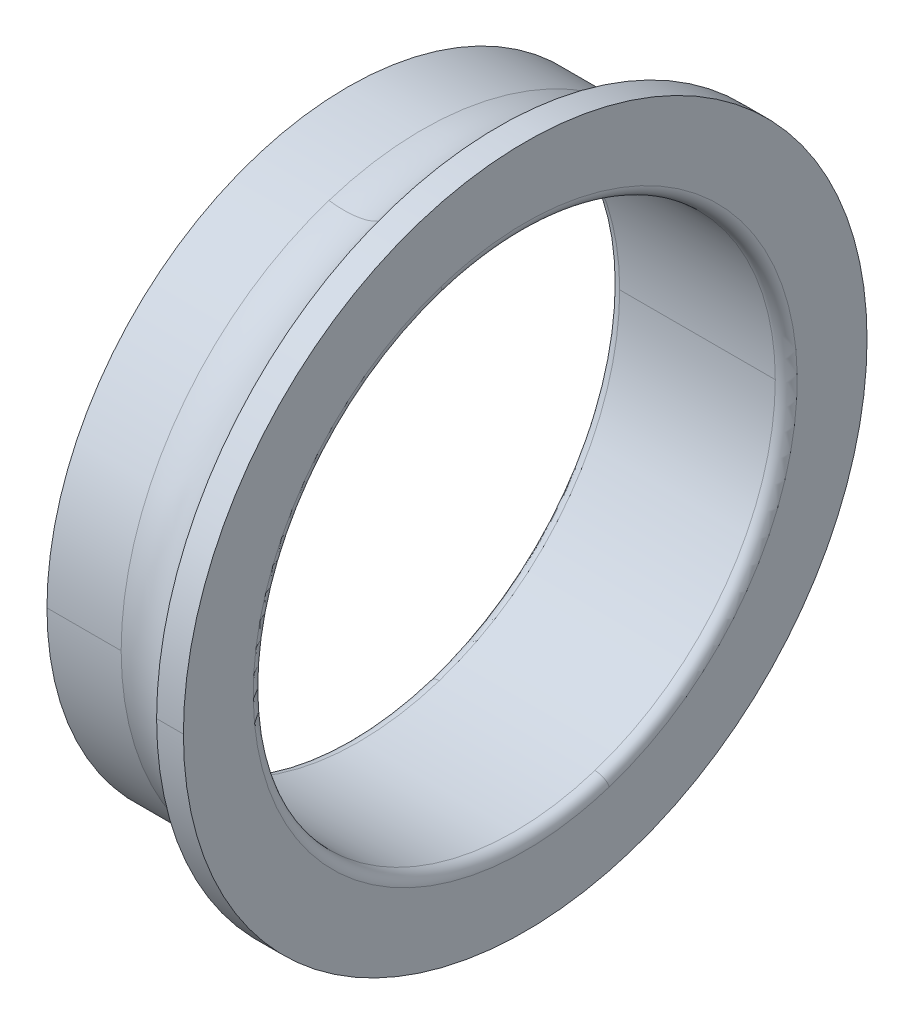
ISO-10303-21;
HEADER;
FILE_DESCRIPTION(('STEP AP214'),'2;1');
FILE_NAME('part.step','',(''),(''),'','','');
FILE_SCHEMA(('AUTOMOTIVE_DESIGN { 1 0 10303 214 1 1 1 1 }'));
ENDSEC;
DATA;
#1=APPLICATION_CONTEXT('core data for automotive mechanical design processes');
#2=APPLICATION_PROTOCOL_DEFINITION('international standard','automotive_design',2000,#1);
#3=PRODUCT_CONTEXT('',#1,'mechanical');
#4=PRODUCT('Part','Part','',(#3));
#5=PRODUCT_RELATED_PRODUCT_CATEGORY('part','',(#4));
#6=PRODUCT_DEFINITION_FORMATION('','',#4);
#7=PRODUCT_DEFINITION_CONTEXT('part definition',#1,'design');
#8=PRODUCT_DEFINITION('design','',#6,#7);
#9=PRODUCT_DEFINITION_SHAPE('','',#8);
#10=(LENGTH_UNIT() NAMED_UNIT(*) SI_UNIT(.MILLI.,.METRE.));
#11=(NAMED_UNIT(*) PLANE_ANGLE_UNIT() SI_UNIT($,.RADIAN.));
#12=(NAMED_UNIT(*) SI_UNIT($,.STERADIAN.) SOLID_ANGLE_UNIT());
#13=UNCERTAINTY_MEASURE_WITH_UNIT(LENGTH_MEASURE(1.E-05),#10,'distance_accuracy_value','');
#14=(GEOMETRIC_REPRESENTATION_CONTEXT(3) GLOBAL_UNCERTAINTY_ASSIGNED_CONTEXT((#13)) GLOBAL_UNIT_ASSIGNED_CONTEXT((#10,
#11,#12)) REPRESENTATION_CONTEXT('',''));
#15=CARTESIAN_POINT('',(0.,0.,0.));
#16=DIRECTION('',(0.,0.,1.));
#17=DIRECTION('',(1.,0.,0.));
#18=AXIS2_PLACEMENT_3D('',#15,#16,#17);
#19=CARTESIAN_POINT('',(34.,0.,0.));
#20=DIRECTION('',(1.,0.,0.));
#21=DIRECTION('',(0.,1.,0.));
#22=AXIS2_PLACEMENT_3D('',#19,#20,#21);
#23=CYLINDRICAL_SURFACE('',#22,57.61);
#24=DIRECTION('',(1.,0.,0.));
#25=VECTOR('',#24,1.);
#26=CARTESIAN_POINT('',(0.,0.,57.61));
#27=LINE('',#26,#25);
#28=CARTESIAN_POINT('',(0.,0.,57.61));
#29=VERTEX_POINT('',#28);
#30=CARTESIAN_POINT('',(14.211111332448,0.,57.61));
#31=VERTEX_POINT('',#30);
#32=EDGE_CURVE('E10',#29,#31,#27,.T.);
#33=ORIENTED_EDGE('',*,*,#32,.F.);
#34=CARTESIAN_POINT('',(0.,0.,0.));
#35=DIRECTION('',(1.,0.,0.));
#36=DIRECTION('',(0.,0.,-1.));
#37=AXIS2_PLACEMENT_3D('',#34,#35,#36);
#38=CIRCLE('',#37,57.61);
#39=CARTESIAN_POINT('',(0.,0.,-57.61));
#40=VERTEX_POINT('',#39);
#41=EDGE_CURVE('E24',#29,#40,#38,.T.);
#42=ORIENTED_EDGE('',*,*,#41,.T.);
#43=DIRECTION('',(1.,0.,0.));
#44=VECTOR('',#43,1.);
#45=CARTESIAN_POINT('',(0.,0.,-57.61));
#46=LINE('',#45,#44);
#47=CARTESIAN_POINT('',(14.211111332448,0.,-57.61));
#48=VERTEX_POINT('',#47);
#49=EDGE_CURVE('E325',#40,#48,#46,.T.);
#50=ORIENTED_EDGE('',*,*,#49,.T.);
#51=CARTESIAN_POINT('',(14.211111332448,0.,0.));
#52=DIRECTION('',(1.,0.,0.));
#53=DIRECTION('',(0.,0.,-1.));
#54=AXIS2_PLACEMENT_3D('',#51,#52,#53);
#55=CIRCLE('',#54,57.61);
#56=CARTESIAN_POINT('',(14.211111332448,-54.7903659037638,-17.8024690459407));
#57=VERTEX_POINT('',#56);
#58=EDGE_CURVE('E320',#57,#48,#55,.T.);
#59=ORIENTED_EDGE('',*,*,#58,.F.);
#60=CARTESIAN_POINT('',(14.211111332448,0.,0.));
#61=DIRECTION('',(1.,0.,0.));
#62=DIRECTION('',(0.,0.,-1.));
#63=AXIS2_PLACEMENT_3D('',#60,#61,#62);
#64=CIRCLE('',#63,57.61);
#65=EDGE_CURVE('E315',#31,#57,#64,.T.);
#66=ORIENTED_EDGE('',*,*,#65,.F.);
#67=EDGE_LOOP('',(#33,#42,#50,#59,#66));
#68=FACE_BOUND('',#67,.T.);
#69=ADVANCED_FACE('F16',(#68),#23,.T.);
#70=CARTESIAN_POINT('',(17.0000000000004,0.,0.));
#71=DIRECTION('',(1.,0.,0.));
#72=DIRECTION('',(0.,0.309016994374947,-0.951056516295154));
#73=AXIS2_PLACEMENT_3D('',#70,#71,#72);
#74=TOROIDAL_SURFACE('',#73,69.9999999999986,12.6999999999987);
#75=CARTESIAN_POINT('',(17.0000000000004,-66.5739561406594,-21.6311896062459));
#76=DIRECTION('',(0.,0.309016994374947,-0.951056516295154));
#77=DIRECTION('',(-0.219597532878165,0.927841750936756,0.301474059866578));
#78=AXIS2_PLACEMENT_3D('',#75,#76,#77);
#79=CIRCLE('',#78,12.6999999999987);
#80=CARTESIAN_POINT('',(28.866523290332,-62.2704254044252,-20.2328877066997));
#81=VERTEX_POINT('',#80);
#82=EDGE_CURVE('E311',#57,#81,#79,.T.);
#83=ORIENTED_EDGE('',*,*,#82,.T.);
#84=CARTESIAN_POINT('',(28.866523290332,0.,0.));
#85=DIRECTION('',(1.,0.,0.));
#86=DIRECTION('',(0.,0.,-1.));
#87=AXIS2_PLACEMENT_3D('',#84,#85,#86);
#88=CIRCLE('',#87,65.475);
#89=CARTESIAN_POINT('',(28.866523290332,0.,65.475));
#90=VERTEX_POINT('',#89);
#91=EDGE_CURVE('E109',#90,#81,#88,.T.);
#92=ORIENTED_EDGE('',*,*,#91,.F.);
#93=CARTESIAN_POINT('',(28.866523290332,0.,0.));
#94=DIRECTION('',(1.,0.,0.));
#95=DIRECTION('',(0.,0.,-1.));
#96=AXIS2_PLACEMENT_3D('',#93,#94,#95);
#97=CIRCLE('',#96,65.475);
#98=CARTESIAN_POINT('',(28.866523290332,62.2704254044252,20.2328877066997));
#99=VERTEX_POINT('',#98);
#100=EDGE_CURVE('E304',#99,#90,#97,.T.);
#101=ORIENTED_EDGE('',*,*,#100,.F.);
#102=CARTESIAN_POINT('',(17.0000000000004,66.5739561406594,21.6311896062459));
#103=DIRECTION('',(0.,-0.309016994374947,0.951056516295154));
#104=DIRECTION('',(-0.219597532878166,-0.927841750936756,-0.301474059866579));
#105=AXIS2_PLACEMENT_3D('',#102,#103,#104);
#106=CIRCLE('',#105,12.6999999999987);
#107=CARTESIAN_POINT('',(14.211111332448,54.7903659037638,17.8024690459407));
#108=VERTEX_POINT('',#107);
#109=EDGE_CURVE('E119',#108,#99,#106,.T.);
#110=ORIENTED_EDGE('',*,*,#109,.F.);
#111=CARTESIAN_POINT('',(14.211111332448,0.,0.));
#112=DIRECTION('',(1.,0.,0.));
#113=DIRECTION('',(0.,0.,-1.));
#114=AXIS2_PLACEMENT_3D('',#111,#112,#113);
#115=CIRCLE('',#114,57.61);
#116=EDGE_CURVE('E296',#108,#31,#115,.T.);
#117=ORIENTED_EDGE('',*,*,#116,.T.);
#118=ORIENTED_EDGE('',*,*,#65,.T.);
#119=EDGE_LOOP('',(#83,#92,#101,#110,#117,#118));
#120=FACE_BOUND('',#119,.T.);
#121=ADVANCED_FACE('F338',(#120),#74,.F.);
#122=CARTESIAN_POINT('',(34.,0.,0.));
#123=DIRECTION('',(1.,0.,0.));
#124=DIRECTION('',(0.,-1.,0.));
#125=AXIS2_PLACEMENT_3D('',#122,#123,#124);
#126=CYLINDRICAL_SURFACE('',#125,57.61);
#127=ORIENTED_EDGE('',*,*,#32,.T.);
#128=ORIENTED_EDGE('',*,*,#116,.F.);
#129=CARTESIAN_POINT('',(14.211111332448,0.,0.));
#130=DIRECTION('',(1.,0.,0.));
#131=DIRECTION('',(0.,0.,-1.));
#132=AXIS2_PLACEMENT_3D('',#129,#130,#131);
#133=CIRCLE('',#132,57.61);
#134=EDGE_CURVE('E292',#48,#108,#133,.T.);
#135=ORIENTED_EDGE('',*,*,#134,.F.);
#136=ORIENTED_EDGE('',*,*,#49,.F.);
#137=CARTESIAN_POINT('',(0.,0.,0.));
#138=DIRECTION('',(1.,0.,0.));
#139=DIRECTION('',(0.,0.,-1.));
#140=AXIS2_PLACEMENT_3D('',#137,#138,#139);
#141=CIRCLE('',#140,57.61);
#142=EDGE_CURVE('E288',#40,#29,#141,.T.);
#143=ORIENTED_EDGE('',*,*,#142,.T.);
#144=EDGE_LOOP('',(#127,#128,#135,#136,#143));
#145=FACE_BOUND('',#144,.T.);
#146=ADVANCED_FACE('F269',(#145),#126,.T.);
#147=CARTESIAN_POINT('',(0.,57.61,0.));
#148=DIRECTION('',(-1.,0.,0.));
#149=DIRECTION('',(0.,0.,1.));
#150=AXIS2_PLACEMENT_3D('',#147,#148,#149);
#151=PLANE('',#150);
#152=CARTESIAN_POINT('',(0.,0.,0.));
#153=DIRECTION('',(1.,0.,0.));
#154=DIRECTION('',(0.,0.,-1.));
#155=AXIS2_PLACEMENT_3D('',#152,#153,#154);
#156=CIRCLE('',#155,52.1);
#157=CARTESIAN_POINT('',(0.,49.5500444989775,16.0997854069348));
#158=VERTEX_POINT('',#157);
#159=CARTESIAN_POINT('',(0.,-49.5500444989775,-16.0997854069347));
#160=VERTEX_POINT('',#159);
#161=EDGE_CURVE('E286',#158,#160,#156,.T.);
#162=ORIENTED_EDGE('',*,*,#161,.T.);
#163=CARTESIAN_POINT('',(0.,-49.5500444989775,-16.0997854069348));
#164=CARTESIAN_POINT('',(0.,-47.020993404906,-23.8830153699321));
#165=CARTESIAN_POINT('',(0.,-42.9643381224154,-31.1701393265632));
#166=CARTESIAN_POINT('',(0.,-37.507305709523,-37.5591590254004));
#167=CARTESIAN_POINT('',(0.,-24.3822766482969,-47.8528940411944));
#168=CARTESIAN_POINT('',(0.,-8.33976113960479,-52.4208125330667));
#169=CARTESIAN_POINT('',(0.,0.0366678337703485,-53.0800660743622));
#170=CARTESIAN_POINT('',(0.,16.5962293327078,-51.07794179646));
#171=CARTESIAN_POINT('',(0.,31.170015128553,-42.9642283286278));
#172=CARTESIAN_POINT('',(0.,37.559189011093,-37.5073395926926));
#173=CARTESIAN_POINT('',(0.,47.8529015669521,-24.3822618781658));
#174=CARTESIAN_POINT('',(0.,52.4207674958585,-8.33975679669732));
#175=CARTESIAN_POINT('',(0.,53.0802279011612,0.036631890638656));
#176=CARTESIAN_POINT('',(0.,52.0788669716818,8.31648116035218));
#177=CARTESIAN_POINT('',(0.,49.5500444989775,16.0997854069347));
#178=B_SPLINE_CURVE_WITH_KNOTS('',5,(#163,#164,#165,#166,#167,#168,#169,#170,#171,#172,#173,
#174,#175,#176,#177),.UNSPECIFIED.,.F.,.F.,(6,3,3,3,6),(0.,0.785398163397448,1.5707963267949,
2.35619449019234,3.14159265358979),.UNSPECIFIED.);
#179=EDGE_CURVE('E284',#160,#158,#178,.T.);
#180=ORIENTED_EDGE('',*,*,#179,.T.);
#181=EDGE_LOOP('',(#162,#180));
#182=FACE_BOUND('',#181,.T.);
#183=ORIENTED_EDGE('',*,*,#41,.F.);
#184=ORIENTED_EDGE('',*,*,#142,.F.);
#185=EDGE_LOOP('',(#183,#184));
#186=FACE_BOUND('',#185,.T.);
#187=ADVANCED_FACE('F263',(#182,#186),#151,.T.);
#188=CARTESIAN_POINT('',(2.09999999999956,0.,0.));
#189=DIRECTION('',(1.,0.,0.));
#190=DIRECTION('',(0.,-0.309016994374947,0.951056516295154));
#191=AXIS2_PLACEMENT_3D('',#188,#189,#190);
#192=TOROIDAL_SURFACE('',#191,52.1,2.09999999999956);
#193=CARTESIAN_POINT('',(2.09999999999956,-49.5500444989775,-16.0997854069347));
#194=DIRECTION('',(0.,0.309016994374947,-0.951056516295154));
#195=DIRECTION('',(-1.,0.,0.));
#196=AXIS2_PLACEMENT_3D('',#193,#194,#195);
#197=CIRCLE('',#196,2.09999999999956);
#198=CARTESIAN_POINT('',(2.1,-47.5528258147581,-15.4508497187475));
#199=VERTEX_POINT('',#198);
#200=EDGE_CURVE('E493',#160,#199,#197,.T.);
#201=ORIENTED_EDGE('',*,*,#200,.T.);
#202=CARTESIAN_POINT('',(2.1,0.,0.));
#203=DIRECTION('',(1.,0.,0.));
#204=DIRECTION('',(0.,0.,-1.));
#205=AXIS2_PLACEMENT_3D('',#202,#203,#204);
#206=CIRCLE('',#205,50.);
#207=CARTESIAN_POINT('',(2.1,0.,-50.));
#208=VERTEX_POINT('',#207);
#209=EDGE_CURVE('E491',#199,#208,#206,.T.);
#210=ORIENTED_EDGE('',*,*,#209,.T.);
#211=CARTESIAN_POINT('',(2.1,0.,0.));
#212=DIRECTION('',(1.,0.,0.));
#213=DIRECTION('',(0.,0.,-1.));
#214=AXIS2_PLACEMENT_3D('',#211,#212,#213);
#215=CIRCLE('',#214,50.);
#216=CARTESIAN_POINT('',(2.1,47.5528258147581,15.4508497187475));
#217=VERTEX_POINT('',#216);
#218=EDGE_CURVE('E489',#208,#217,#215,.T.);
#219=ORIENTED_EDGE('',*,*,#218,.T.);
#220=CARTESIAN_POINT('',(2.09999999999956,49.5500444989775,16.0997854069348));
#221=DIRECTION('',(0.,-0.309016994374947,0.951056516295154));
#222=DIRECTION('',(-1.,0.,0.));
#223=AXIS2_PLACEMENT_3D('',#220,#221,#222);
#224=CIRCLE('',#223,2.09999999999956);
#225=EDGE_CURVE('E243',#158,#217,#224,.T.);
#226=ORIENTED_EDGE('',*,*,#225,.F.);
#227=ORIENTED_EDGE('',*,*,#179,.F.);
#228=EDGE_LOOP('',(#201,#210,#219,#226,#227));
#229=FACE_BOUND('',#228,.T.);
#230=ADVANCED_FACE('F252',(#229),#192,.T.);
#231=CARTESIAN_POINT('',(2.09999999999956,0.,0.));
#232=DIRECTION('',(1.,0.,0.));
#233=DIRECTION('',(0.,0.309016994374947,-0.951056516295154));
#234=AXIS2_PLACEMENT_3D('',#231,#232,#233);
#235=TOROIDAL_SURFACE('',#234,52.1,2.09999999999956);
#236=ORIENTED_EDGE('',*,*,#200,.F.);
#237=ORIENTED_EDGE('',*,*,#161,.F.);
#238=ORIENTED_EDGE('',*,*,#225,.T.);
#239=CARTESIAN_POINT('',(2.1,0.,0.));
#240=DIRECTION('',(1.,0.,0.));
#241=DIRECTION('',(0.,0.,-1.));
#242=AXIS2_PLACEMENT_3D('',#239,#240,#241);
#243=CIRCLE('',#242,50.);
#244=CARTESIAN_POINT('',(2.1,0.,50.));
#245=VERTEX_POINT('',#244);
#246=EDGE_CURVE('E239',#217,#245,#243,.T.);
#247=ORIENTED_EDGE('',*,*,#246,.T.);
#248=CARTESIAN_POINT('',(2.1,0.,0.));
#249=DIRECTION('',(1.,0.,0.));
#250=DIRECTION('',(0.,0.,-1.));
#251=AXIS2_PLACEMENT_3D('',#248,#249,#250);
#252=CIRCLE('',#251,50.);
#253=EDGE_CURVE('E234',#245,#199,#252,.T.);
#254=ORIENTED_EDGE('',*,*,#253,.T.);
#255=EDGE_LOOP('',(#236,#237,#238,#247,#254));
#256=FACE_BOUND('',#255,.T.);
#257=ADVANCED_FACE('F262',(#256),#235,.T.);
#258=CARTESIAN_POINT('',(34.,0.,0.));
#259=DIRECTION('',(1.,0.,0.));
#260=DIRECTION('',(0.,1.,0.));
#261=AXIS2_PLACEMENT_3D('',#258,#259,#260);
#262=CYLINDRICAL_SURFACE('',#261,50.);
#263=DIRECTION('',(1.,0.,0.));
#264=VECTOR('',#263,1.);
#265=CARTESIAN_POINT('',(2.1,0.,50.));
#266=LINE('',#265,#264);
#267=CARTESIAN_POINT('',(31.9,0.,50.));
#268=VERTEX_POINT('',#267);
#269=EDGE_CURVE('E230',#245,#268,#266,.T.);
#270=ORIENTED_EDGE('',*,*,#269,.T.);
#271=CARTESIAN_POINT('',(31.9,0.,0.));
#272=DIRECTION('',(1.,0.,0.));
#273=DIRECTION('',(0.,0.,-1.));
#274=AXIS2_PLACEMENT_3D('',#271,#272,#273);
#275=CIRCLE('',#274,50.);
#276=CARTESIAN_POINT('',(31.9,-47.5528258147577,-15.4508497187474));
#277=VERTEX_POINT('',#276);
#278=EDGE_CURVE('E226',#268,#277,#275,.T.);
#279=ORIENTED_EDGE('',*,*,#278,.T.);
#280=CARTESIAN_POINT('',(31.9,0.,0.));
#281=DIRECTION('',(1.,0.,0.));
#282=DIRECTION('',(0.,0.,-1.));
#283=AXIS2_PLACEMENT_3D('',#280,#281,#282);
#284=CIRCLE('',#283,50.);
#285=CARTESIAN_POINT('',(31.9,0.,-50.));
#286=VERTEX_POINT('',#285);
#287=EDGE_CURVE('E222',#277,#286,#284,.T.);
#288=ORIENTED_EDGE('',*,*,#287,.T.);
#289=DIRECTION('',(1.,0.,0.));
#290=VECTOR('',#289,1.);
#291=CARTESIAN_POINT('',(2.10000000000001,0.,-50.));
#292=LINE('',#291,#290);
#293=EDGE_CURVE('E217',#208,#286,#292,.T.);
#294=ORIENTED_EDGE('',*,*,#293,.F.);
#295=ORIENTED_EDGE('',*,*,#209,.F.);
#296=ORIENTED_EDGE('',*,*,#253,.F.);
#297=EDGE_LOOP('',(#270,#279,#288,#294,#295,#296));
#298=FACE_BOUND('',#297,.T.);
#299=ADVANCED_FACE('F389',(#298),#262,.F.);
#300=CARTESIAN_POINT('',(34.,0.,0.));
#301=DIRECTION('',(1.,0.,0.));
#302=DIRECTION('',(0.,-1.,0.));
#303=AXIS2_PLACEMENT_3D('',#300,#301,#302);
#304=CYLINDRICAL_SURFACE('',#303,50.);
#305=ORIENTED_EDGE('',*,*,#269,.F.);
#306=ORIENTED_EDGE('',*,*,#246,.F.);
#307=ORIENTED_EDGE('',*,*,#218,.F.);
#308=ORIENTED_EDGE('',*,*,#293,.T.);
#309=CARTESIAN_POINT('',(31.9,0.,0.));
#310=DIRECTION('',(1.,0.,0.));
#311=DIRECTION('',(0.,0.,-1.));
#312=AXIS2_PLACEMENT_3D('',#309,#310,#311);
#313=CIRCLE('',#312,50.);
#314=CARTESIAN_POINT('',(31.9,47.5528258147577,15.4508497187474));
#315=VERTEX_POINT('',#314);
#316=EDGE_CURVE('E213',#286,#315,#313,.T.);
#317=ORIENTED_EDGE('',*,*,#316,.T.);
#318=CARTESIAN_POINT('',(31.9,0.,0.));
#319=DIRECTION('',(1.,0.,0.));
#320=DIRECTION('',(0.,0.,-1.));
#321=AXIS2_PLACEMENT_3D('',#318,#319,#320);
#322=CIRCLE('',#321,50.);
#323=EDGE_CURVE('E208',#315,#268,#322,.T.);
#324=ORIENTED_EDGE('',*,*,#323,.T.);
#325=EDGE_LOOP('',(#305,#306,#307,#308,#317,#324));
#326=FACE_BOUND('',#325,.T.);
#327=ADVANCED_FACE('F399',(#326),#304,.F.);
#328=CARTESIAN_POINT('',(31.9000000000009,0.,0.));
#329=DIRECTION('',(1.,0.,0.));
#330=DIRECTION('',(0.,0.309016994374947,-0.951056516295154));
#331=AXIS2_PLACEMENT_3D('',#328,#329,#330);
#332=TOROIDAL_SURFACE('',#331,52.0999999999992,2.09999999999915);
#333=CARTESIAN_POINT('',(31.9000000000009,-49.5500444989767,-16.0997854069345));
#334=DIRECTION('',(0.,0.309016994374948,-0.951056516295154));
#335=DIRECTION('',(-4.04332652016032E-13,0.951056516295154,0.309016994374948));
#336=AXIS2_PLACEMENT_3D('',#333,#334,#335);
#337=CIRCLE('',#336,2.09999999999914);
#338=CARTESIAN_POINT('',(34.,-49.5500444989767,-16.0997854069345));
#339=VERTEX_POINT('',#338);
#340=EDGE_CURVE('E187',#277,#339,#337,.T.);
#341=ORIENTED_EDGE('',*,*,#340,.F.);
#342=ORIENTED_EDGE('',*,*,#278,.F.);
#343=ORIENTED_EDGE('',*,*,#323,.F.);
#344=CARTESIAN_POINT('',(31.9000000000009,49.5500444989767,16.0997854069345));
#345=DIRECTION('',(0.,-0.309016994374948,0.951056516295153));
#346=DIRECTION('',(-4.06024420434509E-13,-0.951056516295153,-0.309016994374948));
#347=AXIS2_PLACEMENT_3D('',#344,#345,#346);
#348=CIRCLE('',#347,2.09999999999914);
#349=CARTESIAN_POINT('',(34.,49.5500444989767,16.0997854069345));
#350=VERTEX_POINT('',#349);
#351=EDGE_CURVE('E186',#315,#350,#348,.T.);
#352=ORIENTED_EDGE('',*,*,#351,.T.);
#353=CARTESIAN_POINT('',(34.,49.5500444989767,16.0997854069346));
#354=CARTESIAN_POINT('',(34.,49.286629308515,16.91055252093));
#355=CARTESIAN_POINT('',(34.,49.0032817476948,17.714841597304));
#356=CARTESIAN_POINT('',(34.,48.3974787988117,19.308554316115));
#357=CARTESIAN_POINT('',(34.,48.0750234107489,20.0979779585519));
#358=CARTESIAN_POINT('',(34.,47.3917617208551,21.6600504507949));
#359=CARTESIAN_POINT('',(34.,47.0309554190241,22.4326993006008));
#360=CARTESIAN_POINT('',(34.,46.2718664503926,23.9593628566644));
#361=CARTESIAN_POINT('',(34.,45.8735837835921,24.713377562922));
#362=CARTESIAN_POINT('',(34.,45.0405001533919,26.2009558010601));
#363=CARTESIAN_POINT('',(34.,44.6056991899923,26.9345193329405));
#364=CARTESIAN_POINT('',(34.,43.7006268232215,28.3794281491156));
#365=CARTESIAN_POINT('',(34.,43.2303554198502,29.0907734334103));
#366=CARTESIAN_POINT('',(34.,42.255474995507,30.4895320223061));
#367=CARTESIAN_POINT('',(34.,41.750865974535,31.1769453269073));
#368=CARTESIAN_POINT('',(34.,40.7085259898204,32.5261839280081));
#369=CARTESIAN_POINT('',(34.,40.1707950260777,33.1880092245078));
#370=CARTESIAN_POINT('',(34.,39.0635065894442,34.4844774114964));
#371=CARTESIAN_POINT('',(34.,38.4939491165535,35.1191203019854));
#372=CARTESIAN_POINT('',(34.,37.3243797774379,36.3596947673917));
#373=CARTESIAN_POINT('',(34.,36.7243679112131,36.9656263423091));
#374=CARTESIAN_POINT('',(34.,35.4953352660409,38.147318434134));
#375=CARTESIAN_POINT('',(34.,34.8663144870935,38.7230789510414));
#376=CARTESIAN_POINT('',(34.,33.5807793827702,39.8430418693843));
#377=CARTESIAN_POINT('',(34.,32.9242650573942,40.3872442708197));
#378=CARTESIAN_POINT('',(34.,31.5853244606894,41.4427799269527));
#379=CARTESIAN_POINT('',(34.,30.9028981893605,41.9541131816502));
#380=CARTESIAN_POINT('',(34.,29.5137777254212,42.942678697713));
#381=CARTESIAN_POINT('',(34.,28.8070835328107,43.4199109590783));
#382=CARTESIAN_POINT('',(34.,27.3711297145145,44.3391247941575));
#383=CARTESIAN_POINT('',(34.,26.6418700888289,44.7811063678713));
#384=CARTESIAN_POINT('',(34.,25.1625422546968,45.6287540553238));
#385=CARTESIAN_POINT('',(34.,24.4124740462505,46.0344201690624));
#386=CARTESIAN_POINT('',(34.,22.8933360266094,46.8084596513641));
#387=CARTESIAN_POINT('',(34.,22.1242662154147,47.1768330199273));
#388=CARTESIAN_POINT('',(34.,20.5689777468144,47.8753995681675));
#389=CARTESIAN_POINT('',(34.,19.782759089409,48.2055927478446));
#390=CARTESIAN_POINT('',(34.,18.1950669979977,48.8270034540213));
#391=CARTESIAN_POINT('',(34.,17.3935935639919,49.118220980521));
#392=CARTESIAN_POINT('',(34.,15.7773227390832,49.6609788118141));
#393=CARTESIAN_POINT('',(34.,14.9625253481803,49.9125191166074));
#394=CARTESIAN_POINT('',(34.,13.3215695277599,50.3753165218611));
#395=CARTESIAN_POINT('',(34.,12.4954110982425,50.5865736223215));
#396=CARTESIAN_POINT('',(34.,10.8337234886126,50.9682956820504));
#397=CARTESIAN_POINT('',(34.,9.99819430850021,51.1387606413189));
#398=CARTESIAN_POINT('',(34.,8.31977806065911,51.4384877536462));
#399=CARTESIAN_POINT('',(34.,7.4768909929304,51.567749906705));
#400=CARTESIAN_POINT('',(34.,5.78578955863101,51.7847600027641));
#401=CARTESIAN_POINT('',(34.,4.93757519206033,51.8725079457644));
#402=CARTESIAN_POINT('',(34.,3.23786258278086,52.006278229226));
#403=CARTESIAN_POINT('',(34.,2.38636434007208,52.0523005696873));
#404=CARTESIAN_POINT('',(34.,0.68213531236553,52.1025087762217));
#405=CARTESIAN_POINT('',(34.,-0.170595472632234,52.1066946422948));
#406=CARTESIAN_POINT('',(34.,-1.87523528176529,52.0732198159348));
#407=CARTESIAN_POINT('',(34.,-2.72714430590058,52.0355591235016));
#408=CARTESIAN_POINT('',(34.,-4.42808826985113,51.9184819080358));
#409=CARTESIAN_POINT('',(34.,-5.27712320966638,51.8390653850032));
#410=CARTESIAN_POINT('',(34.,-6.97027360544017,51.6386678296985));
#411=CARTESIAN_POINT('',(34.,-7.81438906139869,51.5176867974265));
#412=CARTESIAN_POINT('',(34.,-9.49566694138985,51.2344516775464));
#413=CARTESIAN_POINT('',(34.,-10.3328293654225,51.0721975899383));
#414=CARTESIAN_POINT('',(34.,-11.9981843839555,50.706807243695));
#415=CARTESIAN_POINT('',(34.,-12.826376978456,50.5036709850598));
#416=CARTESIAN_POINT('',(34.,-14.4717971494234,50.0570056698019));
#417=CARTESIAN_POINT('',(34.,-15.2890247258904,49.8134766131792));
#418=CARTESIAN_POINT('',(34.,-16.9105460879786,49.2866123847743));
#419=CARTESIAN_POINT('',(34.,-17.7148398735998,49.0032772129921));
#420=CARTESIAN_POINT('',(34.,-19.308556039819,48.3974833335144));
#421=CARTESIAN_POINT('',(34.,-20.097978420417,48.0750246258189));
#422=CARTESIAN_POINT('',(34.,-21.6600499889297,47.3917605057852));
#423=CARTESIAN_POINT('',(34.,-22.4326991768444,47.0309550934472));
#424=CARTESIAN_POINT('',(34.,-23.9593629804207,46.2718667759696));
#425=CARTESIAN_POINT('',(34.,-24.7133775960824,45.8735838708302));
#426=CARTESIAN_POINT('',(34.,-26.2009557678996,45.0405000661539));
#427=CARTESIAN_POINT('',(34.,-26.9345193240551,44.605699166617));
#428=CARTESIAN_POINT('',(34.,-28.3794281580009,43.7006268465969));
#429=CARTESIAN_POINT('',(34.,-29.090773435791,43.2303554261136));
#430=CARTESIAN_POINT('',(34.,-30.4895320199253,42.2554749892436));
#431=CARTESIAN_POINT('',(34.,-31.1769453262693,41.7508659728568));
#432=CARTESIAN_POINT('',(34.,-32.526183928646,40.7085259914987));
#433=CARTESIAN_POINT('',(34.,-33.1880092246787,40.1707950265274));
#434=CARTESIAN_POINT('',(34.,-34.4844774113254,39.0635065889946));
#435=CARTESIAN_POINT('',(34.,-35.1191203019395,38.493949116433));
#436=CARTESIAN_POINT('',(34.,-36.3596947674375,37.3243797775585));
#437=CARTESIAN_POINT('',(34.,-36.9656263423214,36.7243679112455));
#438=CARTESIAN_POINT('',(34.,-38.1473184341216,35.4953352660087));
#439=CARTESIAN_POINT('',(34.,-38.7230789510381,34.866314487085));
#440=CARTESIAN_POINT('',(34.,-39.8430418693875,33.5807793827789));
#441=CARTESIAN_POINT('',(34.,-40.3872442708206,32.9242650573966));
#442=CARTESIAN_POINT('',(34.,-41.4427799269518,31.5853244606871));
#443=CARTESIAN_POINT('',(34.,-41.9541131816499,30.90289818936));
#444=CARTESIAN_POINT('',(34.,-42.9426786977132,29.5137777254219));
#445=CARTESIAN_POINT('',(34.,-43.4199109590783,28.8070835328109));
#446=CARTESIAN_POINT('',(34.,-44.3391247941574,27.3711297145144));
#447=CARTESIAN_POINT('',(34.,-44.7811063678713,26.6418700888289));
#448=CARTESIAN_POINT('',(34.,-45.6287540553238,25.1625422546969));
#449=CARTESIAN_POINT('',(34.,-46.0344201690624,24.4124740462506));
#450=CARTESIAN_POINT('',(34.,-46.8084596513641,22.8933360266095));
#451=CARTESIAN_POINT('',(34.,-47.1768330199272,22.1242662154147));
#452=CARTESIAN_POINT('',(34.,-47.8753995681675,20.5689777468145));
#453=CARTESIAN_POINT('',(34.,-48.2055927478447,19.782759089409));
#454=CARTESIAN_POINT('',(34.,-48.8270034540211,18.1950669979979));
#455=CARTESIAN_POINT('',(34.,-49.1182209805204,17.3935935639922));
#456=CARTESIAN_POINT('',(34.,-49.6609788118147,15.7773227390831));
#457=CARTESIAN_POINT('',(34.,-49.9125191166098,14.9625253481797));
#458=CARTESIAN_POINT('',(34.,-50.3753165218587,13.3215695277606));
#459=CARTESIAN_POINT('',(34.,-50.5865736223126,12.4954110982449));
#460=CARTESIAN_POINT('',(34.,-50.9682956820593,10.8337234886103));
#461=CARTESIAN_POINT('',(34.,-51.1387606413523,9.99819430849124));
#462=CARTESIAN_POINT('',(34.,-51.4384877536129,8.31977806066825));
#463=CARTESIAN_POINT('',(34.,-51.5677499065806,7.47689099296427));
#464=CARTESIAN_POINT('',(34.,-51.7847600028885,5.78578955859734));
#465=CARTESIAN_POINT('',(34.,-51.8725079462287,4.93757519193439));
#466=CARTESIAN_POINT('',(34.,-52.0062782287617,3.23786258290699));
#467=CARTESIAN_POINT('',(34.,-52.0523005679546,2.38636434054254));
#468=CARTESIAN_POINT('',(34.,-52.1025087779544,0.68213531189526));
#469=CARTESIAN_POINT('',(34.,-52.1066946487614,-0.170595474387565));
#470=CARTESIAN_POINT('',(34.,-52.0732198094681,-1.87523528000977));
#471=CARTESIAN_POINT('',(34.,-52.0355590993679,-2.72714429934915));
#472=CARTESIAN_POINT('',(34.,-51.9184819321696,-4.42808827640238));
#473=CARTESIAN_POINT('',(34.,-51.8390654750715,-5.27712323411624));
#474=CARTESIAN_POINT('',(34.,-51.6386677396302,-6.9702735809902));
#475=CARTESIAN_POINT('',(34.,-51.517686461287,-7.81438897015031));
#476=CARTESIAN_POINT('',(34.,-51.2344520136859,-9.49566703263813));
#477=CARTESIAN_POINT('',(34.,-51.072198844428,-10.3328297059658));
#478=CARTESIAN_POINT('',(34.,-50.7068059892053,-11.998184043412));
#479=CARTESIAN_POINT('',(34.,-50.5036663032405,-12.8263757075305));
#480=CARTESIAN_POINT('',(34.,-50.0570103516213,-14.4717984203488));
#481=CARTESIAN_POINT('',(34.,-49.813494085967,-15.2890294690486));
#482=CARTESIAN_POINT('',(34.,-49.5500444989768,-16.0997854069345));
#483=B_SPLINE_CURVE_WITH_KNOTS('',3,(#353,#354,#355,#356,#357,#358,#359,#360,#361,#362,#363,
#364,#365,#366,#367,#368,#369,#370,#371,#372,#373,#374,#375,#376,#377,#378,#379,#380,#381,#382,
#383,#384,#385,#386,#387,#388,#389,#390,#391,#392,#393,#394,#395,#396,#397,#398,#399,#400,#401,
#402,#403,#404,#405,#406,#407,#408,#409,#410,#411,#412,#413,#414,#415,#416,#417,#418,#419,#420,
#421,#422,#423,#424,#425,#426,#427,#428,#429,#430,#431,#432,#433,#434,#435,#436,#437,#438,#439,
#440,#441,#442,#443,#444,#445,#446,#447,#448,#449,#450,#451,#452,#453,#454,#455,#456,#457,#458,
#459,#460,#461,#462,#463,#464,#465,#466,#467,#468,#469,#470,#471,#472,#473,#474,#475,#476,#477,
#478,#479,#480,#481,#482),.UNSPECIFIED.,.F.,.F.,(4,2,2,2,2,2,2,2,2,2,2,2,2,2,2,2,2,2,2,2,2,2,2,
2,2,2,2,2,2,2,2,2,2,2,2,2,2,2,2,2,2,2,2,2,2,2,2,2,2,2,2,2,2,2,2,2,2,2,2,2,2,2,2,2,4),(0.,
2.55719601208741,5.11439202417483,7.67158803626225,10.2287840483497,12.7859800604371,
15.3431760725245,17.9003720846119,20.4575680966994,23.0147641087868,25.5719601208742,
28.1291561329616,30.686352145049,33.2435481571364,35.8007441692239,38.3579401813113,
40.9151361933987,43.4723322054861,46.0295282175735,48.586724229661,51.1439202417484,
53.7011162538358,56.2583122659232,58.8155082780107,61.3727042900981,63.9299003021855,
66.4870963142729,69.0442923263603,71.6014883384477,74.1586843505351,76.7158803626226,
79.27307637471,81.8302723867974,84.3874683988848,86.9446644109722,89.5018604230596,
92.0590564351471,94.6162524472345,97.1734484593219,99.7306444714093,102.287840483497,
104.845036495584,107.402232507672,109.959428519759,112.516624531846,115.073820543934,
117.631016556021,120.188212568109,122.745408580196,125.302604592284,127.859800604371,
130.416996616458,132.974192628546,135.531388640633,138.088584652721,140.645780664808,
143.202976676895,145.760172688983,148.31736870107,150.874564713158,153.431760725245,
155.988956737333,158.54615274942,161.103348761507,163.660544773595),.UNSPECIFIED.);
#484=EDGE_CURVE('E181',#350,#339,#483,.T.);
#485=ORIENTED_EDGE('',*,*,#484,.T.);
#486=EDGE_LOOP('',(#341,#342,#343,#352,#485));
#487=FACE_BOUND('',#486,.T.);
#488=ADVANCED_FACE('F161',(#487),#332,.T.);
#489=CARTESIAN_POINT('',(34.,52.1,0.));
#490=DIRECTION('',(1.,0.,0.));
#491=DIRECTION('',(0.,0.,-1.));
#492=AXIS2_PLACEMENT_3D('',#489,#490,#491);
#493=PLANE('',#492);
#494=CARTESIAN_POINT('',(34.,0.,0.));
#495=DIRECTION('',(1.,0.,0.));
#496=DIRECTION('',(0.,0.,-1.));
#497=AXIS2_PLACEMENT_3D('',#494,#495,#496);
#498=CIRCLE('',#497,65.475);
#499=CARTESIAN_POINT('',(34.,0.,-65.475));
#500=VERTEX_POINT('',#499);
#501=CARTESIAN_POINT('',(34.,0.,65.475));
#502=VERTEX_POINT('',#501);
#503=EDGE_CURVE('E126',#500,#502,#498,.T.);
#504=ORIENTED_EDGE('',*,*,#503,.T.);
#505=CARTESIAN_POINT('',(34.,0.,0.));
#506=DIRECTION('',(1.,0.,0.));
#507=DIRECTION('',(0.,0.,-1.));
#508=AXIS2_PLACEMENT_3D('',#505,#506,#507);
#509=CIRCLE('',#508,65.475);
#510=EDGE_CURVE('E189',#502,#500,#509,.T.);
#511=ORIENTED_EDGE('',*,*,#510,.T.);
#512=EDGE_LOOP('',(#504,#511));
#513=FACE_BOUND('',#512,.T.);
#514=CARTESIAN_POINT('',(34.,-49.5500444989767,-16.0997854069346));
#515=CARTESIAN_POINT('',(34.,-49.286629308515,-16.91055252093));
#516=CARTESIAN_POINT('',(34.,-49.0032817476948,-17.714841597304));
#517=CARTESIAN_POINT('',(34.,-48.3974787988117,-19.3085543161149));
#518=CARTESIAN_POINT('',(34.,-48.0750234107489,-20.0979779585519));
#519=CARTESIAN_POINT('',(34.,-47.3917617208551,-21.6600504507949));
#520=CARTESIAN_POINT('',(34.,-47.0309554190241,-22.4326993006008));
#521=CARTESIAN_POINT('',(34.,-46.2718664503926,-23.9593628566644));
#522=CARTESIAN_POINT('',(34.,-45.8735837835921,-24.713377562922));
#523=CARTESIAN_POINT('',(34.,-45.0405001533919,-26.2009558010601));
#524=CARTESIAN_POINT('',(34.,-44.6056991899923,-26.9345193329405));
#525=CARTESIAN_POINT('',(34.,-43.7006268232215,-28.3794281491156));
#526=CARTESIAN_POINT('',(34.,-43.2303554198502,-29.0907734334103));
#527=CARTESIAN_POINT('',(34.,-42.255474995507,-30.4895320223061));
#528=CARTESIAN_POINT('',(34.,-41.750865974535,-31.1769453269073));
#529=CARTESIAN_POINT('',(34.,-40.7085259898204,-32.5261839280081));
#530=CARTESIAN_POINT('',(34.,-40.1707950260777,-33.1880092245078));
#531=CARTESIAN_POINT('',(34.,-39.0635065894442,-34.4844774114964));
#532=CARTESIAN_POINT('',(34.,-38.4939491165535,-35.1191203019854));
#533=CARTESIAN_POINT('',(34.,-37.324379777438,-36.3596947673917));
#534=CARTESIAN_POINT('',(34.,-36.7243679112131,-36.9656263423091));
#535=CARTESIAN_POINT('',(34.,-35.4953352660409,-38.1473184341339));
#536=CARTESIAN_POINT('',(34.,-34.8663144870936,-38.7230789510414));
#537=CARTESIAN_POINT('',(34.,-33.5807793827702,-39.8430418693843));
#538=CARTESIAN_POINT('',(34.,-32.9242650573942,-40.3872442708197));
#539=CARTESIAN_POINT('',(34.,-31.5853244606894,-41.4427799269527));
#540=CARTESIAN_POINT('',(34.,-30.9028981893605,-41.9541131816502));
#541=CARTESIAN_POINT('',(34.,-29.5137777254212,-42.942678697713));
#542=CARTESIAN_POINT('',(34.,-28.8070835328107,-43.4199109590783));
#543=CARTESIAN_POINT('',(34.,-27.3711297145146,-44.3391247941575));
#544=CARTESIAN_POINT('',(34.,-26.6418700888289,-44.7811063678713));
#545=CARTESIAN_POINT('',(34.,-25.1625422546969,-45.6287540553238));
#546=CARTESIAN_POINT('',(34.,-24.4124740462505,-46.0344201690624));
#547=CARTESIAN_POINT('',(34.,-22.8933360266095,-46.8084596513641));
#548=CARTESIAN_POINT('',(34.,-22.1242662154147,-47.1768330199273));
#549=CARTESIAN_POINT('',(34.,-20.5689777468145,-47.8753995681675));
#550=CARTESIAN_POINT('',(34.,-19.782759089409,-48.2055927478445));
#551=CARTESIAN_POINT('',(34.,-18.1950669979978,-48.8270034540213));
#552=CARTESIAN_POINT('',(34.,-17.3935935639919,-49.118220980521));
#553=CARTESIAN_POINT('',(34.,-15.7773227390832,-49.6609788118141));
#554=CARTESIAN_POINT('',(34.,-14.9625253481803,-49.9125191166074));
#555=CARTESIAN_POINT('',(34.,-13.32156952776,-50.3753165218611));
#556=CARTESIAN_POINT('',(34.,-12.4954110982425,-50.5865736223215));
#557=CARTESIAN_POINT('',(34.,-10.8337234886127,-50.9682956820504));
#558=CARTESIAN_POINT('',(34.,-9.99819430850029,-51.1387606413189));
#559=CARTESIAN_POINT('',(34.,-8.31977806065921,-51.4384877536462));
#560=CARTESIAN_POINT('',(34.,-7.4768909929305,-51.567749906705));
#561=CARTESIAN_POINT('',(34.,-5.7857895586311,-51.7847600027641));
#562=CARTESIAN_POINT('',(34.,-4.93757519206042,-51.8725079457644));
#563=CARTESIAN_POINT('',(34.,-3.23786258278093,-52.006278229226));
#564=CARTESIAN_POINT('',(34.,-2.38636434007214,-52.0523005696873));
#565=CARTESIAN_POINT('',(34.,-0.682135312365588,-52.1025087762217));
#566=CARTESIAN_POINT('',(34.,0.170595472632169,-52.1066946422948));
#567=CARTESIAN_POINT('',(34.,1.87523528176522,-52.0732198159348));
#568=CARTESIAN_POINT('',(34.,2.72714430590052,-52.0355591235016));
#569=CARTESIAN_POINT('',(34.,4.42808826985107,-51.9184819080358));
#570=CARTESIAN_POINT('',(34.,5.27712320966632,-51.8390653850032));
#571=CARTESIAN_POINT('',(34.,6.97027360544009,-51.6386678296985));
#572=CARTESIAN_POINT('',(34.,7.81438906139862,-51.5176867974265));
#573=CARTESIAN_POINT('',(34.,9.49566694138977,-51.2344516775464));
#574=CARTESIAN_POINT('',(34.,10.3328293654224,-51.0721975899383));
#575=CARTESIAN_POINT('',(34.,11.9981843839555,-50.7068072436951));
#576=CARTESIAN_POINT('',(34.,12.8263769784559,-50.5036709850598));
#577=CARTESIAN_POINT('',(34.,14.4717971494233,-50.0570056698019));
#578=CARTESIAN_POINT('',(34.,15.2890247258904,-49.8134766131792));
#579=CARTESIAN_POINT('',(34.,16.9105460879786,-49.2866123847743));
#580=CARTESIAN_POINT('',(34.,17.7148398735997,-49.0032772129922));
#581=CARTESIAN_POINT('',(34.,19.3085560398189,-48.3974833335145));
#582=CARTESIAN_POINT('',(34.,20.0979784204169,-48.0750246258189));
#583=CARTESIAN_POINT('',(34.,21.6600499889296,-47.3917605057853));
#584=CARTESIAN_POINT('',(34.,22.4326991768443,-47.0309550934472));
#585=CARTESIAN_POINT('',(34.,23.9593629804207,-46.2718667759697));
#586=CARTESIAN_POINT('',(34.,24.7133775960823,-45.8735838708302));
#587=CARTESIAN_POINT('',(34.,26.2009557678995,-45.0405000661539));
#588=CARTESIAN_POINT('',(34.,26.9345193240551,-44.605699166617));
#589=CARTESIAN_POINT('',(34.,28.3794281580008,-43.7006268465969));
#590=CARTESIAN_POINT('',(34.,29.090773435791,-43.2303554261137));
#591=CARTESIAN_POINT('',(34.,30.4895320199252,-42.2554749892436));
#592=CARTESIAN_POINT('',(34.,31.1769453262692,-41.7508659728569));
#593=CARTESIAN_POINT('',(34.,32.5261839286459,-40.7085259914988));
#594=CARTESIAN_POINT('',(34.,33.1880092246786,-40.1707950265275));
#595=CARTESIAN_POINT('',(34.,34.4844774113254,-39.0635065889946));
#596=CARTESIAN_POINT('',(34.,35.1191203019394,-38.4939491164331));
#597=CARTESIAN_POINT('',(34.,36.3596947674374,-37.3243797775586));
#598=CARTESIAN_POINT('',(34.,36.9656263423213,-36.7243679112455));
#599=CARTESIAN_POINT('',(34.,38.1473184341216,-35.4953352660088));
#600=CARTESIAN_POINT('',(34.,38.723078951038,-34.866314487085));
#601=CARTESIAN_POINT('',(34.,39.8430418693875,-33.580779382779));
#602=CARTESIAN_POINT('',(34.,40.3872442708205,-32.9242650573967));
#603=CARTESIAN_POINT('',(34.,41.4427799269517,-31.5853244606872));
#604=CARTESIAN_POINT('',(34.,41.9541131816498,-30.9028981893601));
#605=CARTESIAN_POINT('',(34.,42.9426786977131,-29.513777725422));
#606=CARTESIAN_POINT('',(34.,43.4199109590783,-28.807083532811));
#607=CARTESIAN_POINT('',(34.,44.3391247941573,-27.3711297145146));
#608=CARTESIAN_POINT('',(34.,44.7811063678712,-26.641870088829));
#609=CARTESIAN_POINT('',(34.,45.6287540553237,-25.1625422546971));
#610=CARTESIAN_POINT('',(34.,46.0344201690623,-24.4124740462507));
#611=CARTESIAN_POINT('',(34.,46.808459651364,-22.8933360266096));
#612=CARTESIAN_POINT('',(34.,47.1768330199271,-22.1242662154148));
#613=CARTESIAN_POINT('',(34.,47.8753995681674,-20.5689777468146));
#614=CARTESIAN_POINT('',(34.,48.2055927478447,-19.7827590894091));
#615=CARTESIAN_POINT('',(34.,48.8270034540211,-18.1950669979979));
#616=CARTESIAN_POINT('',(34.,49.1182209805203,-17.3935935639922));
#617=CARTESIAN_POINT('',(34.,49.6609788118147,-15.7773227390832));
#618=CARTESIAN_POINT('',(34.,49.9125191166097,-14.9625253481798));
#619=CARTESIAN_POINT('',(34.,50.3753165218587,-13.3215695277608));
#620=CARTESIAN_POINT('',(34.,50.5865736223125,-12.4954110982451));
#621=CARTESIAN_POINT('',(34.,50.9682956820593,-10.8337234886104));
#622=CARTESIAN_POINT('',(34.,51.1387606413522,-9.99819430849138));
#623=CARTESIAN_POINT('',(34.,51.4384877536129,-8.31977806066839));
#624=CARTESIAN_POINT('',(34.,51.5677499065806,-7.47689099296441));
#625=CARTESIAN_POINT('',(34.,51.7847600028885,-5.78578955859748));
#626=CARTESIAN_POINT('',(34.,51.8725079462286,-4.93757519193453));
#627=CARTESIAN_POINT('',(34.,52.0062782287617,-3.23786258290714));
#628=CARTESIAN_POINT('',(34.,52.0523005679546,-2.38636434054268));
#629=CARTESIAN_POINT('',(34.,52.1025087779544,-0.682135311895404));
#630=CARTESIAN_POINT('',(34.,52.1066946487614,0.17059547438742));
#631=CARTESIAN_POINT('',(34.,52.0732198094681,1.87523528000962));
#632=CARTESIAN_POINT('',(34.,52.0355590993679,2.727144299349));
#633=CARTESIAN_POINT('',(34.,51.9184819321696,4.42808827640224));
#634=CARTESIAN_POINT('',(34.,51.8390654750715,5.27712323411609));
#635=CARTESIAN_POINT('',(34.,51.6386677396302,6.97027358099005));
#636=CARTESIAN_POINT('',(34.,51.517686461287,7.81438897015016));
#637=CARTESIAN_POINT('',(34.,51.2344520136859,9.49566703263799));
#638=CARTESIAN_POINT('',(34.,51.0721988444281,10.3328297059657));
#639=CARTESIAN_POINT('',(34.,50.7068059892054,11.9981840434119));
#640=CARTESIAN_POINT('',(34.,50.5036663032405,12.8263757075303));
#641=CARTESIAN_POINT('',(34.,50.0570103516213,14.4717984203486));
#642=CARTESIAN_POINT('',(34.,49.813494085967,15.2890294690485));
#643=CARTESIAN_POINT('',(34.,49.5500444989768,16.0997854069343));
#644=B_SPLINE_CURVE_WITH_KNOTS('',3,(#514,#515,#516,#517,#518,#519,#520,#521,#522,#523,#524,
#525,#526,#527,#528,#529,#530,#531,#532,#533,#534,#535,#536,#537,#538,#539,#540,#541,#542,#543,
#544,#545,#546,#547,#548,#549,#550,#551,#552,#553,#554,#555,#556,#557,#558,#559,#560,#561,#562,
#563,#564,#565,#566,#567,#568,#569,#570,#571,#572,#573,#574,#575,#576,#577,#578,#579,#580,#581,
#582,#583,#584,#585,#586,#587,#588,#589,#590,#591,#592,#593,#594,#595,#596,#597,#598,#599,#600,
#601,#602,#603,#604,#605,#606,#607,#608,#609,#610,#611,#612,#613,#614,#615,#616,#617,#618,#619,
#620,#621,#622,#623,#624,#625,#626,#627,#628,#629,#630,#631,#632,#633,#634,#635,#636,#637,#638,
#639,#640,#641,#642,#643),.UNSPECIFIED.,.F.,.F.,(4,2,2,2,2,2,2,2,2,2,2,2,2,2,2,2,2,2,2,2,2,2,2,
2,2,2,2,2,2,2,2,2,2,2,2,2,2,2,2,2,2,2,2,2,2,2,2,2,2,2,2,2,2,2,2,2,2,2,2,2,2,2,2,2,4),(0.,
2.55719601208741,5.11439202417484,7.67158803626225,10.2287840483497,12.7859800604371,
15.3431760725245,17.9003720846119,20.4575680966993,23.0147641087867,25.5719601208742,
28.1291561329616,30.686352145049,33.2435481571364,35.8007441692238,38.3579401813112,
40.9151361933987,43.4723322054861,46.0295282175735,48.5867242296609,51.1439202417483,
53.7011162538357,56.2583122659232,58.8155082780106,61.372704290098,63.9299003021854,
66.4870963142728,69.0442923263602,71.6014883384477,74.1586843505351,76.7158803626225,
79.2730763747099,81.8302723867973,84.3874683988847,86.9446644109722,89.5018604230596,
92.059056435147,94.6162524472344,97.1734484593219,99.7306444714093,102.287840483497,
104.845036495584,107.402232507671,109.959428519759,112.516624531846,115.073820543934,
117.631016556021,120.188212568109,122.745408580196,125.302604592283,127.859800604371,
130.416996616458,132.974192628546,135.531388640633,138.08858465272,140.645780664808,
143.202976676895,145.760172688983,148.31736870107,150.874564713158,153.431760725245,
155.988956737332,158.54615274942,161.103348761507,163.660544773595),.UNSPECIFIED.);
#645=EDGE_CURVE('E136',#339,#350,#644,.T.);
#646=ORIENTED_EDGE('',*,*,#645,.F.);
#647=ORIENTED_EDGE('',*,*,#484,.F.);
#648=EDGE_LOOP('',(#646,#647));
#649=FACE_BOUND('',#648,.T.);
#650=ADVANCED_FACE('F155',(#513,#649),#493,.T.);
#651=CARTESIAN_POINT('',(31.9000000000009,0.,0.));
#652=DIRECTION('',(1.,0.,0.));
#653=DIRECTION('',(0.,-0.309016994374947,0.951056516295154));
#654=AXIS2_PLACEMENT_3D('',#651,#652,#653);
#655=TOROIDAL_SURFACE('',#654,52.0999999999992,2.09999999999915);
#656=ORIENTED_EDGE('',*,*,#340,.T.);
#657=ORIENTED_EDGE('',*,*,#645,.T.);
#658=ORIENTED_EDGE('',*,*,#351,.F.);
#659=ORIENTED_EDGE('',*,*,#316,.F.);
#660=ORIENTED_EDGE('',*,*,#287,.F.);
#661=EDGE_LOOP('',(#656,#657,#658,#659,#660));
#662=FACE_BOUND('',#661,.T.);
#663=ADVANCED_FACE('F145',(#662),#655,.T.);
#664=CARTESIAN_POINT('',(34.,0.,0.));
#665=DIRECTION('',(1.,0.,0.));
#666=DIRECTION('',(0.,1.,0.));
#667=AXIS2_PLACEMENT_3D('',#664,#665,#666);
#668=CYLINDRICAL_SURFACE('',#667,65.475);
#669=DIRECTION('',(1.,0.,0.));
#670=VECTOR('',#669,1.);
#671=CARTESIAN_POINT('',(28.866523290332,0.,65.475));
#672=LINE('',#671,#670);
#673=EDGE_CURVE('E112',#90,#502,#672,.T.);
#674=ORIENTED_EDGE('',*,*,#673,.F.);
#675=ORIENTED_EDGE('',*,*,#91,.T.);
#676=CARTESIAN_POINT('',(28.866523290332,0.,0.));
#677=DIRECTION('',(1.,0.,0.));
#678=DIRECTION('',(0.,0.,-1.));
#679=AXIS2_PLACEMENT_3D('',#676,#677,#678);
#680=CIRCLE('',#679,65.475);
#681=CARTESIAN_POINT('',(28.866523290332,0.,-65.475));
#682=VERTEX_POINT('',#681);
#683=EDGE_CURVE('E102',#81,#682,#680,.T.);
#684=ORIENTED_EDGE('',*,*,#683,.T.);
#685=DIRECTION('',(1.,0.,0.));
#686=VECTOR('',#685,1.);
#687=CARTESIAN_POINT('',(28.866523290332,0.,-65.475));
#688=LINE('',#687,#686);
#689=EDGE_CURVE('E108',#682,#500,#688,.T.);
#690=ORIENTED_EDGE('',*,*,#689,.T.);
#691=ORIENTED_EDGE('',*,*,#510,.F.);
#692=EDGE_LOOP('',(#674,#675,#684,#690,#691));
#693=FACE_BOUND('',#692,.T.);
#694=ADVANCED_FACE('F105',(#693),#668,.T.);
#695=CARTESIAN_POINT('',(34.,0.,0.));
#696=DIRECTION('',(1.,0.,0.));
#697=DIRECTION('',(0.,-1.,0.));
#698=AXIS2_PLACEMENT_3D('',#695,#696,#697);
#699=CYLINDRICAL_SURFACE('',#698,65.475);
#700=ORIENTED_EDGE('',*,*,#673,.T.);
#701=ORIENTED_EDGE('',*,*,#503,.F.);
#702=ORIENTED_EDGE('',*,*,#689,.F.);
#703=CARTESIAN_POINT('',(28.866523290332,0.,0.));
#704=DIRECTION('',(1.,0.,0.));
#705=DIRECTION('',(0.,0.,-1.));
#706=AXIS2_PLACEMENT_3D('',#703,#704,#705);
#707=CIRCLE('',#706,65.475);
#708=EDGE_CURVE('E116',#682,#99,#707,.T.);
#709=ORIENTED_EDGE('',*,*,#708,.T.);
#710=ORIENTED_EDGE('',*,*,#100,.T.);
#711=EDGE_LOOP('',(#700,#701,#702,#709,#710));
#712=FACE_BOUND('',#711,.T.);
#713=ADVANCED_FACE('F125',(#712),#699,.T.);
#714=CARTESIAN_POINT('',(17.0000000000004,0.,0.));
#715=DIRECTION('',(1.,0.,0.));
#716=DIRECTION('',(0.,-0.309016994374947,0.951056516295154));
#717=AXIS2_PLACEMENT_3D('',#714,#715,#716);
#718=TOROIDAL_SURFACE('',#717,69.9999999999986,12.6999999999987);
#719=ORIENTED_EDGE('',*,*,#82,.F.);
#720=ORIENTED_EDGE('',*,*,#58,.T.);
#721=ORIENTED_EDGE('',*,*,#134,.T.);
#722=ORIENTED_EDGE('',*,*,#109,.T.);
#723=ORIENTED_EDGE('',*,*,#708,.F.);
#724=ORIENTED_EDGE('',*,*,#683,.F.);
#725=EDGE_LOOP('',(#719,#720,#721,#722,#723,#724));
#726=FACE_BOUND('',#725,.T.);
#727=ADVANCED_FACE('F117',(#726),#718,.F.);
#728=CLOSED_SHELL('',(#69,#121,#146,#187,#230,#257,#299,#327,#488,#650,#663,#694,#713,#727));
#729=MANIFOLD_SOLID_BREP('B1',#728);
#730=ADVANCED_BREP_SHAPE_REPRESENTATION('',(#18,#729),#14);
#731=SHAPE_DEFINITION_REPRESENTATION(#9,#730);
ENDSEC;
END-ISO-10303-21;
